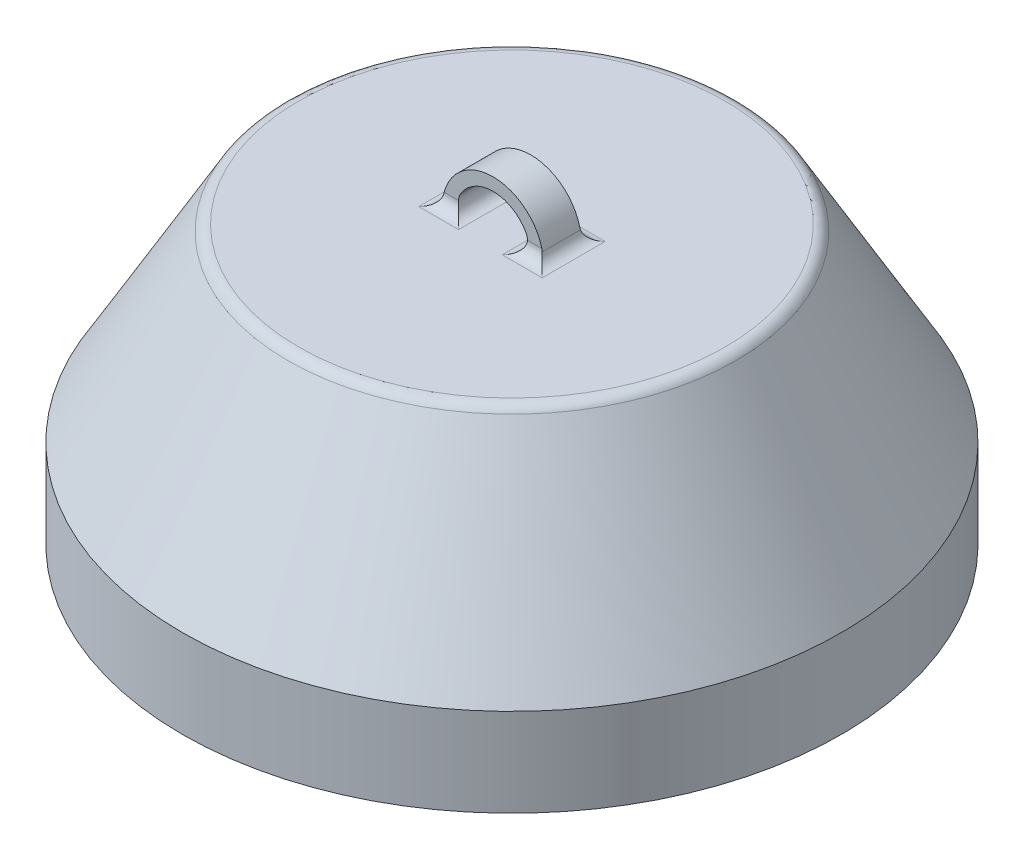
ISO-10303-21;
HEADER;
FILE_DESCRIPTION(('STEP AP214'),'2;1');
FILE_NAME('part.step','',(''),(''),'','','');
FILE_SCHEMA(('AUTOMOTIVE_DESIGN { 1 0 10303 214 1 1 1 1 }'));
ENDSEC;
DATA;
#1=APPLICATION_CONTEXT('core data for automotive mechanical design processes');
#2=APPLICATION_PROTOCOL_DEFINITION('international standard','automotive_design',2000,#1);
#3=PRODUCT_CONTEXT('',#1,'mechanical');
#4=PRODUCT('Part','Part','',(#3));
#5=PRODUCT_RELATED_PRODUCT_CATEGORY('part','',(#4));
#6=PRODUCT_DEFINITION_FORMATION('','',#4);
#7=PRODUCT_DEFINITION_CONTEXT('part definition',#1,'design');
#8=PRODUCT_DEFINITION('design','',#6,#7);
#9=PRODUCT_DEFINITION_SHAPE('','',#8);
#10=(LENGTH_UNIT() NAMED_UNIT(*) SI_UNIT(.MILLI.,.METRE.));
#11=(NAMED_UNIT(*) PLANE_ANGLE_UNIT() SI_UNIT($,.RADIAN.));
#12=(NAMED_UNIT(*) SI_UNIT($,.STERADIAN.) SOLID_ANGLE_UNIT());
#13=UNCERTAINTY_MEASURE_WITH_UNIT(LENGTH_MEASURE(1.E-05),#10,'distance_accuracy_value','');
#14=(GEOMETRIC_REPRESENTATION_CONTEXT(3) GLOBAL_UNCERTAINTY_ASSIGNED_CONTEXT((#13)) GLOBAL_UNIT_ASSIGNED_CONTEXT((#10,
#11,#12)) REPRESENTATION_CONTEXT('',''));
#15=CARTESIAN_POINT('',(0.,0.,0.));
#16=DIRECTION('',(0.,0.,1.));
#17=DIRECTION('',(1.,0.,0.));
#18=AXIS2_PLACEMENT_3D('',#15,#16,#17);
#19=CARTESIAN_POINT('',(0.,0.,0.));
#20=DIRECTION('',(0.,1.,0.));
#21=DIRECTION('',(0.,0.,1.));
#22=AXIS2_PLACEMENT_3D('',#19,#20,#21);
#23=PLANE('',#22);
#24=CARTESIAN_POINT('',(0.,0.,0.));
#25=DIRECTION('',(0.,1.,0.));
#26=DIRECTION('',(0.,0.,1.));
#27=AXIS2_PLACEMENT_3D('',#24,#25,#26);
#28=CIRCLE('',#27,26.15);
#29=CARTESIAN_POINT('',(0.,0.,26.15));
#30=VERTEX_POINT('',#29);
#31=EDGE_CURVE('E302',#30,#30,#28,.T.);
#32=ORIENTED_EDGE('',*,*,#31,.F.);
#33=EDGE_LOOP('',(#32));
#34=FACE_BOUND('',#33,.T.);
#35=CARTESIAN_POINT('',(0.,0.,0.));
#36=DIRECTION('',(0.,1.,0.));
#37=DIRECTION('',(0.,0.,1.));
#38=AXIS2_PLACEMENT_3D('',#35,#36,#37);
#39=CIRCLE('',#38,24.65);
#40=CARTESIAN_POINT('',(0.,0.,24.65));
#41=VERTEX_POINT('',#40);
#42=EDGE_CURVE('E305',#41,#41,#39,.T.);
#43=ORIENTED_EDGE('',*,*,#42,.T.);
#44=EDGE_LOOP('',(#43));
#45=FACE_BOUND('',#44,.T.);
#46=ADVANCED_FACE('F35',(#34,#45),#23,.F.);
#47=CARTESIAN_POINT('',(0.,7.,0.));
#48=DIRECTION('',(0.,-1.,0.));
#49=DIRECTION('',(0.,0.,-1.));
#50=AXIS2_PLACEMENT_3D('',#47,#48,#49);
#51=CYLINDRICAL_SURFACE('',#50,26.15);
#52=CARTESIAN_POINT('',(0.,7.,0.));
#53=DIRECTION('',(0.,1.,0.));
#54=DIRECTION('',(0.,0.,1.));
#55=AXIS2_PLACEMENT_3D('',#52,#53,#54);
#56=CIRCLE('',#55,26.15);
#57=CARTESIAN_POINT('',(0.,7.,26.15));
#58=VERTEX_POINT('',#57);
#59=EDGE_CURVE('E145',#58,#58,#56,.T.);
#60=ORIENTED_EDGE('',*,*,#59,.F.);
#61=EDGE_LOOP('',(#60));
#62=FACE_BOUND('',#61,.T.);
#63=ORIENTED_EDGE('',*,*,#31,.T.);
#64=EDGE_LOOP('',(#63));
#65=FACE_BOUND('',#64,.T.);
#66=ADVANCED_FACE('F243',(#62,#65),#51,.T.);
#67=CARTESIAN_POINT('',(0.,7.,0.));
#68=DIRECTION('',(0.,-1.,0.));
#69=DIRECTION('',(0.,0.,-1.));
#70=AXIS2_PLACEMENT_3D('',#67,#68,#69);
#71=CYLINDRICAL_SURFACE('',#70,24.65);
#72=CARTESIAN_POINT('',(0.,7.,0.));
#73=DIRECTION('',(0.,-1.,0.));
#74=DIRECTION('',(0.,0.,-1.));
#75=AXIS2_PLACEMENT_3D('',#72,#73,#74);
#76=CIRCLE('',#75,24.65);
#77=CARTESIAN_POINT('',(0.,7.,-24.65));
#78=VERTEX_POINT('',#77);
#79=EDGE_CURVE('E310',#78,#78,#76,.T.);
#80=ORIENTED_EDGE('',*,*,#79,.F.);
#81=EDGE_LOOP('',(#80));
#82=FACE_BOUND('',#81,.T.);
#83=ORIENTED_EDGE('',*,*,#42,.F.);
#84=EDGE_LOOP('',(#83));
#85=FACE_BOUND('',#84,.T.);
#86=ADVANCED_FACE('F249',(#82,#85),#71,.F.);
#87=CARTESIAN_POINT('',(0.,7.,0.));
#88=DIRECTION('',(0.,-1.,0.));
#89=DIRECTION('',(0.,0.,1.));
#90=AXIS2_PLACEMENT_3D('',#87,#88,#89);
#91=CONICAL_SURFACE('',#90,26.15,0.5235987755983);
#92=CARTESIAN_POINT('',(0.,21.5,0.));
#93=DIRECTION('',(0.,-1.,0.));
#94=DIRECTION('',(0.,0.,-1.));
#95=AXIS2_PLACEMENT_3D('',#92,#93,#94);
#96=CIRCLE('',#95,17.7784210967504);
#97=CARTESIAN_POINT('',(0.,21.5,-17.7784210967504));
#98=VERTEX_POINT('',#97);
#99=EDGE_CURVE('E166',#98,#98,#96,.T.);
#100=ORIENTED_EDGE('',*,*,#99,.T.);
#101=EDGE_LOOP('',(#100));
#102=FACE_BOUND('',#101,.T.);
#103=ORIENTED_EDGE('',*,*,#59,.T.);
#104=EDGE_LOOP('',(#103));
#105=FACE_BOUND('',#104,.T.);
#106=ADVANCED_FACE('F275',(#102,#105),#91,.T.);
#107=CARTESIAN_POINT('',(0.,22.,0.));
#108=DIRECTION('',(0.,1.,0.));
#109=DIRECTION('',(0.,0.,1.));
#110=AXIS2_PLACEMENT_3D('',#107,#108,#109);
#111=PLANE('',#110);
#112=CARTESIAN_POINT('',(0.,22.,0.));
#113=DIRECTION('',(0.,1.,0.));
#114=DIRECTION('',(0.,0.,1.));
#115=AXIS2_PLACEMENT_3D('',#112,#113,#114);
#116=CIRCLE('',#115,16.912395692966);
#117=CARTESIAN_POINT('',(0.,22.,16.912395692966));
#118=VERTEX_POINT('',#117);
#119=EDGE_CURVE('E163',#118,#118,#116,.T.);
#120=ORIENTED_EDGE('',*,*,#119,.T.);
#121=EDGE_LOOP('',(#120));
#122=FACE_BOUND('',#121,.T.);
#123=DIRECTION('',(1.,0.,0.));
#124=VECTOR('',#123,1.);
#125=CARTESIAN_POINT('',(0.,22.,-2.5));
#126=LINE('',#125,#124);
#127=CARTESIAN_POINT('',(1.73205080756888,22.,-2.5));
#128=VERTEX_POINT('',#127);
#129=CARTESIAN_POINT('',(4.89897948556636,22.,-2.5));
#130=VERTEX_POINT('',#129);
#131=EDGE_CURVE('E158',#128,#130,#126,.T.);
#132=ORIENTED_EDGE('',*,*,#131,.T.);
#133=DIRECTION('',(0.,0.,-1.));
#134=VECTOR('',#133,1.);
#135=CARTESIAN_POINT('',(4.89897948556636,22.,0.));
#136=LINE('',#135,#134);
#137=CARTESIAN_POINT('',(4.89897948556636,22.,2.5));
#138=VERTEX_POINT('',#137);
#139=EDGE_CURVE('E160',#130,#138,#136,.F.);
#140=ORIENTED_EDGE('',*,*,#139,.T.);
#141=DIRECTION('',(1.,0.,0.));
#142=VECTOR('',#141,1.);
#143=CARTESIAN_POINT('',(3.,22.,2.5));
#144=LINE('',#143,#142);
#145=CARTESIAN_POINT('',(1.73205080756888,22.,2.5));
#146=VERTEX_POINT('',#145);
#147=EDGE_CURVE('E150',#138,#146,#144,.F.);
#148=ORIENTED_EDGE('',*,*,#147,.T.);
#149=DIRECTION('',(0.,0.,-1.));
#150=VECTOR('',#149,1.);
#151=CARTESIAN_POINT('',(1.73205080756888,22.,0.));
#152=LINE('',#151,#150);
#153=EDGE_CURVE('E152',#146,#128,#152,.T.);
#154=ORIENTED_EDGE('',*,*,#153,.T.);
#155=EDGE_LOOP('',(#132,#140,#148,#154));
#156=FACE_BOUND('',#155,.T.);
#157=DIRECTION('',(1.,0.,0.));
#158=VECTOR('',#157,1.);
#159=CARTESIAN_POINT('',(0.,22.,-2.5));
#160=LINE('',#159,#158);
#161=CARTESIAN_POINT('',(-4.89897948556636,22.,-2.5));
#162=VERTEX_POINT('',#161);
#163=CARTESIAN_POINT('',(-1.73205080756888,22.,-2.5));
#164=VERTEX_POINT('',#163);
#165=EDGE_CURVE('E149',#162,#164,#160,.T.);
#166=ORIENTED_EDGE('',*,*,#165,.T.);
#167=DIRECTION('',(0.,0.,-1.));
#168=VECTOR('',#167,1.);
#169=CARTESIAN_POINT('',(-1.73205080756888,22.,0.));
#170=LINE('',#169,#168);
#171=CARTESIAN_POINT('',(-1.73205080756888,22.,2.5));
#172=VERTEX_POINT('',#171);
#173=EDGE_CURVE('E129',#164,#172,#170,.F.);
#174=ORIENTED_EDGE('',*,*,#173,.T.);
#175=DIRECTION('',(1.,0.,0.));
#176=VECTOR('',#175,1.);
#177=CARTESIAN_POINT('',(-4.,22.,2.5));
#178=LINE('',#177,#176);
#179=CARTESIAN_POINT('',(-4.89897948556636,22.,2.5));
#180=VERTEX_POINT('',#179);
#181=EDGE_CURVE('E139',#172,#180,#178,.F.);
#182=ORIENTED_EDGE('',*,*,#181,.T.);
#183=DIRECTION('',(0.,0.,-1.));
#184=VECTOR('',#183,1.);
#185=CARTESIAN_POINT('',(-4.89897948556636,22.,0.));
#186=LINE('',#185,#184);
#187=EDGE_CURVE('E144',#180,#162,#186,.T.);
#188=ORIENTED_EDGE('',*,*,#187,.T.);
#189=EDGE_LOOP('',(#166,#174,#182,#188));
#190=FACE_BOUND('',#189,.T.);
#191=ADVANCED_FACE('F147',(#122,#156,#190),#111,.T.);
#192=CARTESIAN_POINT('',(0.,7.,0.));
#193=DIRECTION('',(0.,-1.,0.));
#194=DIRECTION('',(0.,0.,-1.));
#195=AXIS2_PLACEMENT_3D('',#192,#193,#194);
#196=CONICAL_SURFACE('',#195,24.65,0.5235987755983);
#197=ORIENTED_EDGE('',*,*,#79,.T.);
#198=EDGE_LOOP('',(#197));
#199=FACE_BOUND('',#198,.T.);
#200=CARTESIAN_POINT('',(0.,20.5,0.));
#201=DIRECTION('',(0.,1.,0.));
#202=DIRECTION('',(0.,0.,1.));
#203=AXIS2_PLACEMENT_3D('',#200,#201,#202);
#204=CIRCLE('',#203,16.85577136594);
#205=CARTESIAN_POINT('',(0.,20.5,16.85577136594));
#206=VERTEX_POINT('',#205);
#207=EDGE_CURVE('E311',#206,#206,#204,.F.);
#208=ORIENTED_EDGE('',*,*,#207,.F.);
#209=EDGE_LOOP('',(#208));
#210=FACE_BOUND('',#209,.T.);
#211=ADVANCED_FACE('F274',(#199,#210),#196,.F.);
#212=CARTESIAN_POINT('',(0.,20.5,0.));
#213=DIRECTION('',(0.,1.,0.));
#214=DIRECTION('',(0.,0.,1.));
#215=AXIS2_PLACEMENT_3D('',#212,#213,#214);
#216=PLANE('',#215);
#217=ORIENTED_EDGE('',*,*,#207,.T.);
#218=EDGE_LOOP('',(#217));
#219=FACE_BOUND('',#218,.T.);
#220=ADVANCED_FACE('F332',(#219),#216,.F.);
#221=CARTESIAN_POINT('',(0.,22.,1.5));
#222=DIRECTION('',(0.,0.,-1.));
#223=DIRECTION('',(-1.,0.,0.));
#224=AXIS2_PLACEMENT_3D('',#221,#222,#223);
#225=CYLINDRICAL_SURFACE('',#224,4.);
#226=CARTESIAN_POINT('',(0.,22.,1.5));
#227=DIRECTION('',(0.,0.,1.));
#228=DIRECTION('',(1.,0.,0.));
#229=AXIS2_PLACEMENT_3D('',#226,#227,#228);
#230=CIRCLE('',#229,4.);
#231=CARTESIAN_POINT('',(3.87298334620742,23.,1.5));
#232=VERTEX_POINT('',#231);
#233=CARTESIAN_POINT('',(-3.87298334620742,23.,1.5));
#234=VERTEX_POINT('',#233);
#235=EDGE_CURVE('E320',#232,#234,#230,.T.);
#236=ORIENTED_EDGE('',*,*,#235,.F.);
#237=CARTESIAN_POINT('',(3.87298334620742,23.,1.5));
#238=CARTESIAN_POINT('',(3.88161367079,22.9665400879856,1.49998709194956));
#239=CARTESIAN_POINT('',(3.88977885326883,22.9331434653097,1.5016643131653));
#240=CARTESIAN_POINT('',(3.90517893401717,22.8664767986431,1.50839901412834));
#241=CARTESIAN_POINT('',(3.91241383228689,22.8332067546523,1.51345649387485));
#242=CARTESIAN_POINT('',(3.91918358845308,22.8,1.52020410288673));
#243=B_SPLINE_CURVE_WITH_KNOTS('',3,(#237,#238,#239,#240,#241,#242),.UNSPECIFIED.,.F.,.F.,(4,2,
4),(0.,0.103263542156258,0.206527084287963),.UNSPECIFIED.);
#244=CARTESIAN_POINT('',(3.91918358845308,22.8,1.52020410288673));
#245=VERTEX_POINT('',#244);
#246=EDGE_CURVE('E214',#232,#245,#243,.T.);
#247=ORIENTED_EDGE('',*,*,#246,.T.);
#248=DIRECTION('',(0.,0.,-1.));
#249=VECTOR('',#248,1.);
#250=CARTESIAN_POINT('',(3.91918358845309,22.8,1.5));
#251=LINE('',#250,#249);
#252=CARTESIAN_POINT('',(3.91918358845308,22.8,-1.52020410288673));
#253=VERTEX_POINT('',#252);
#254=EDGE_CURVE('E170',#245,#253,#251,.T.);
#255=ORIENTED_EDGE('',*,*,#254,.T.);
#256=CARTESIAN_POINT('',(3.91918358845308,22.8,-1.52020410288673));
#257=CARTESIAN_POINT('',(3.91241383228687,22.8332067546522,-1.51345649387486));
#258=CARTESIAN_POINT('',(3.90517893401715,22.8664767986431,-1.50839901412835));
#259=CARTESIAN_POINT('',(3.88977885326885,22.9331434653097,-1.50166431316529));
#260=CARTESIAN_POINT('',(3.88161367079005,22.9665400879856,-1.49998709194953));
#261=CARTESIAN_POINT('',(3.87298334620752,23.,-1.49999999999995));
#262=B_SPLINE_CURVE_WITH_KNOTS('',3,(#256,#257,#258,#259,#260,#261),.UNSPECIFIED.,.F.,.F.,(4,2,
4),(0.,0.103263542131702,0.206527084287951),.UNSPECIFIED.);
#263=CARTESIAN_POINT('',(3.87298334620742,23.,-1.5));
#264=VERTEX_POINT('',#263);
#265=EDGE_CURVE('E185',#253,#264,#262,.T.);
#266=ORIENTED_EDGE('',*,*,#265,.T.);
#267=CARTESIAN_POINT('',(0.,22.,-1.5));
#268=DIRECTION('',(0.,0.,1.));
#269=DIRECTION('',(1.,0.,0.));
#270=AXIS2_PLACEMENT_3D('',#267,#268,#269);
#271=CIRCLE('',#270,4.);
#272=CARTESIAN_POINT('',(-3.87298334620742,23.,-1.5));
#273=VERTEX_POINT('',#272);
#274=EDGE_CURVE('E298',#264,#273,#271,.T.);
#275=ORIENTED_EDGE('',*,*,#274,.T.);
#276=CARTESIAN_POINT('',(-3.87298334620742,23.,-1.5));
#277=CARTESIAN_POINT('',(-3.88161367079,22.9665400879856,-1.49998709194956));
#278=CARTESIAN_POINT('',(-3.88977885326883,22.9331434653097,-1.5016643131653));
#279=CARTESIAN_POINT('',(-3.90517893401717,22.8664767986431,-1.50839901412834));
#280=CARTESIAN_POINT('',(-3.91241383228689,22.8332067546523,-1.51345649387485));
#281=CARTESIAN_POINT('',(-3.91918358845308,22.8,-1.52020410288673));
#282=B_SPLINE_CURVE_WITH_KNOTS('',3,(#276,#277,#278,#279,#280,#281),.UNSPECIFIED.,.F.,.F.,(4,2,
4),(0.,0.103263542156258,0.206527084287963),.UNSPECIFIED.);
#283=CARTESIAN_POINT('',(-3.91918358845308,22.8,-1.52020410288673));
#284=VERTEX_POINT('',#283);
#285=EDGE_CURVE('E44',#273,#284,#282,.T.);
#286=ORIENTED_EDGE('',*,*,#285,.T.);
#287=DIRECTION('',(0.,0.,-1.));
#288=VECTOR('',#287,1.);
#289=CARTESIAN_POINT('',(-3.91918358845309,22.8,1.5));
#290=LINE('',#289,#288);
#291=CARTESIAN_POINT('',(-3.91918358845308,22.8,1.52020410288673));
#292=VERTEX_POINT('',#291);
#293=EDGE_CURVE('E51',#284,#292,#290,.F.);
#294=ORIENTED_EDGE('',*,*,#293,.T.);
#295=CARTESIAN_POINT('',(-3.91918358845308,22.8,1.52020410288673));
#296=CARTESIAN_POINT('',(-3.91241383228687,22.8332067546522,1.51345649387486));
#297=CARTESIAN_POINT('',(-3.90517893401715,22.8664767986431,1.50839901412835));
#298=CARTESIAN_POINT('',(-3.88977885326885,22.9331434653097,1.50166431316529));
#299=CARTESIAN_POINT('',(-3.88161367079005,22.9665400879856,1.49998709194953));
#300=CARTESIAN_POINT('',(-3.87298334620752,23.,1.49999999999995));
#301=B_SPLINE_CURVE_WITH_KNOTS('',3,(#295,#296,#297,#298,#299,#300),.UNSPECIFIED.,.F.,.F.,(4,2,
4),(0.,0.103263542131702,0.206527084287951),.UNSPECIFIED.);
#302=EDGE_CURVE('E12',#292,#234,#301,.T.);
#303=ORIENTED_EDGE('',*,*,#302,.T.);
#304=EDGE_LOOP('',(#236,#247,#255,#266,#275,#286,#294,#303));
#305=FACE_BOUND('',#304,.T.);
#306=ADVANCED_FACE('F194',(#305),#225,.T.);
#307=CARTESIAN_POINT('',(0.,22.,1.5));
#308=DIRECTION('',(0.,0.,-1.));
#309=DIRECTION('',(-1.,0.,0.));
#310=AXIS2_PLACEMENT_3D('',#307,#308,#309);
#311=CYLINDRICAL_SURFACE('',#310,3.);
#312=CARTESIAN_POINT('',(0.,22.,-1.5));
#313=DIRECTION('',(0.,0.,-1.));
#314=DIRECTION('',(1.,0.,0.));
#315=AXIS2_PLACEMENT_3D('',#312,#313,#314);
#316=CIRCLE('',#315,3.);
#317=CARTESIAN_POINT('',(-2.59807621135332,23.5,-1.5));
#318=VERTEX_POINT('',#317);
#319=CARTESIAN_POINT('',(2.59807621135332,23.5,-1.5));
#320=VERTEX_POINT('',#319);
#321=EDGE_CURVE('E317',#318,#320,#316,.T.);
#322=ORIENTED_EDGE('',*,*,#321,.T.);
#323=DIRECTION('',(0.,0.,-1.));
#324=VECTOR('',#323,1.);
#325=CARTESIAN_POINT('',(2.59807621135332,23.5,1.5));
#326=LINE('',#325,#324);
#327=CARTESIAN_POINT('',(2.59807621135332,23.5,1.5));
#328=VERTEX_POINT('',#327);
#329=EDGE_CURVE('E179',#320,#328,#326,.F.);
#330=ORIENTED_EDGE('',*,*,#329,.T.);
#331=CARTESIAN_POINT('',(0.,22.,1.5));
#332=DIRECTION('',(0.,0.,-1.));
#333=DIRECTION('',(1.,0.,0.));
#334=AXIS2_PLACEMENT_3D('',#331,#332,#333);
#335=CIRCLE('',#334,3.);
#336=CARTESIAN_POINT('',(-2.59807621135332,23.5,1.5));
#337=VERTEX_POINT('',#336);
#338=EDGE_CURVE('E314',#337,#328,#335,.T.);
#339=ORIENTED_EDGE('',*,*,#338,.F.);
#340=DIRECTION('',(0.,0.,-1.));
#341=VECTOR('',#340,1.);
#342=CARTESIAN_POINT('',(-2.59807621135332,23.5,1.5));
#343=LINE('',#342,#341);
#344=EDGE_CURVE('E176',#337,#318,#343,.T.);
#345=ORIENTED_EDGE('',*,*,#344,.T.);
#346=EDGE_LOOP('',(#322,#330,#339,#345));
#347=FACE_BOUND('',#346,.T.);
#348=ADVANCED_FACE('F331',(#347),#311,.F.);
#349=CARTESIAN_POINT('',(0.,22.,1.5));
#350=DIRECTION('',(0.,0.,1.));
#351=DIRECTION('',(1.,0.,0.));
#352=AXIS2_PLACEMENT_3D('',#349,#350,#351);
#353=PLANE('',#352);
#354=CARTESIAN_POINT('',(1.73205080756888,23.,1.5));
#355=DIRECTION('',(0.,0.,1.));
#356=DIRECTION('',(1.,0.,0.));
#357=AXIS2_PLACEMENT_3D('',#354,#355,#356);
#358=CIRCLE('',#357,1.);
#359=CARTESIAN_POINT('',(2.73205080756888,23.,1.5));
#360=VERTEX_POINT('',#359);
#361=EDGE_CURVE('E221',#328,#360,#358,.F.);
#362=ORIENTED_EDGE('',*,*,#361,.T.);
#363=DIRECTION('',(1.,0.,0.));
#364=VECTOR('',#363,1.);
#365=CARTESIAN_POINT('',(4.,23.,1.5));
#366=LINE('',#365,#364);
#367=EDGE_CURVE('E183',#360,#232,#366,.T.);
#368=ORIENTED_EDGE('',*,*,#367,.T.);
#369=ORIENTED_EDGE('',*,*,#235,.T.);
#370=DIRECTION('',(1.,0.,0.));
#371=VECTOR('',#370,1.);
#372=CARTESIAN_POINT('',(-3.,23.,1.5));
#373=LINE('',#372,#371);
#374=CARTESIAN_POINT('',(-2.73205080756888,23.,1.5));
#375=VERTEX_POINT('',#374);
#376=EDGE_CURVE('E181',#234,#375,#373,.T.);
#377=ORIENTED_EDGE('',*,*,#376,.T.);
#378=CARTESIAN_POINT('',(-1.73205080756888,23.,1.5));
#379=DIRECTION('',(0.,0.,1.));
#380=DIRECTION('',(1.,0.,0.));
#381=AXIS2_PLACEMENT_3D('',#378,#379,#380);
#382=CIRCLE('',#381,1.);
#383=EDGE_CURVE('E132',#375,#337,#382,.F.);
#384=ORIENTED_EDGE('',*,*,#383,.T.);
#385=ORIENTED_EDGE('',*,*,#338,.T.);
#386=EDGE_LOOP('',(#362,#368,#369,#377,#384,#385));
#387=FACE_BOUND('',#386,.T.);
#388=ADVANCED_FACE('F265',(#387),#353,.T.);
#389=CARTESIAN_POINT('',(0.,22.,-1.5));
#390=DIRECTION('',(0.,0.,1.));
#391=DIRECTION('',(1.,0.,0.));
#392=AXIS2_PLACEMENT_3D('',#389,#390,#391);
#393=PLANE('',#392);
#394=ORIENTED_EDGE('',*,*,#274,.F.);
#395=DIRECTION('',(1.,0.,0.));
#396=VECTOR('',#395,1.);
#397=CARTESIAN_POINT('',(0.,23.,-1.5));
#398=LINE('',#397,#396);
#399=CARTESIAN_POINT('',(2.73205080756888,23.,-1.5));
#400=VERTEX_POINT('',#399);
#401=EDGE_CURVE('E174',#264,#400,#398,.F.);
#402=ORIENTED_EDGE('',*,*,#401,.T.);
#403=CARTESIAN_POINT('',(1.73205080756888,23.,-1.5));
#404=DIRECTION('',(0.,0.,1.));
#405=DIRECTION('',(1.,0.,0.));
#406=AXIS2_PLACEMENT_3D('',#403,#404,#405);
#407=CIRCLE('',#406,1.);
#408=EDGE_CURVE('E192',#400,#320,#407,.T.);
#409=ORIENTED_EDGE('',*,*,#408,.T.);
#410=ORIENTED_EDGE('',*,*,#321,.F.);
#411=CARTESIAN_POINT('',(-1.73205080756888,23.,-1.5));
#412=DIRECTION('',(0.,0.,1.));
#413=DIRECTION('',(1.,0.,0.));
#414=AXIS2_PLACEMENT_3D('',#411,#412,#413);
#415=CIRCLE('',#414,1.);
#416=CARTESIAN_POINT('',(-2.73205080756888,23.,-1.5));
#417=VERTEX_POINT('',#416);
#418=EDGE_CURVE('E220',#318,#417,#415,.T.);
#419=ORIENTED_EDGE('',*,*,#418,.T.);
#420=DIRECTION('',(1.,0.,0.));
#421=VECTOR('',#420,1.);
#422=CARTESIAN_POINT('',(0.,23.,-1.5));
#423=LINE('',#422,#421);
#424=EDGE_CURVE('E172',#417,#273,#423,.F.);
#425=ORIENTED_EDGE('',*,*,#424,.T.);
#426=EDGE_LOOP('',(#394,#402,#409,#410,#419,#425));
#427=FACE_BOUND('',#426,.T.);
#428=ADVANCED_FACE('F258',(#427),#393,.F.);
#429=CARTESIAN_POINT('',(0.,21.,0.));
#430=DIRECTION('',(0.,1.,0.));
#431=DIRECTION('',(0.,0.,1.));
#432=AXIS2_PLACEMENT_3D('',#429,#430,#431);
#433=TOROIDAL_SURFACE('',#432,16.912395692966,1.);
#434=ORIENTED_EDGE('',*,*,#99,.F.);
#435=EDGE_LOOP('',(#434));
#436=FACE_BOUND('',#435,.T.);
#437=ORIENTED_EDGE('',*,*,#119,.F.);
#438=EDGE_LOOP('',(#437));
#439=FACE_BOUND('',#438,.T.);
#440=ADVANCED_FACE('F256',(#436,#439),#433,.T.);
#441=CARTESIAN_POINT('',(1.73205080756888,23.,1.5));
#442=DIRECTION('',(0.,0.,-1.));
#443=DIRECTION('',(-1.,0.,0.));
#444=AXIS2_PLACEMENT_3D('',#441,#442,#443);
#445=CYLINDRICAL_SURFACE('',#444,1.);
#446=CARTESIAN_POINT('',(1.73205080756888,23.,-2.5));
#447=DIRECTION('',(0.707106781186547,0.,-0.707106781186547));
#448=DIRECTION('',(-0.707106781186547,0.,-0.707106781186547));
#449=AXIS2_PLACEMENT_3D('',#446,#447,#448);
#450=ELLIPSE('',#449,1.41421356237309,1.);
#451=EDGE_CURVE('E291',#128,#400,#450,.F.);
#452=ORIENTED_EDGE('',*,*,#451,.F.);
#453=ORIENTED_EDGE('',*,*,#153,.F.);
#454=CARTESIAN_POINT('',(1.73205080756888,23.,2.5));
#455=DIRECTION('',(-0.707106781186547,0.,-0.707106781186547));
#456=DIRECTION('',(-0.707106781186547,0.,0.707106781186547));
#457=AXIS2_PLACEMENT_3D('',#454,#455,#456);
#458=ELLIPSE('',#457,1.41421356237309,1.);
#459=EDGE_CURVE('E295',#360,#146,#458,.T.);
#460=ORIENTED_EDGE('',*,*,#459,.F.);
#461=ORIENTED_EDGE('',*,*,#361,.F.);
#462=ORIENTED_EDGE('',*,*,#329,.F.);
#463=ORIENTED_EDGE('',*,*,#408,.F.);
#464=EDGE_LOOP('',(#452,#453,#460,#461,#462,#463));
#465=FACE_BOUND('',#464,.T.);
#466=ADVANCED_FACE('F210',(#465),#445,.F.);
#467=CARTESIAN_POINT('',(0.,23.,2.5));
#468=DIRECTION('',(-1.,0.,0.));
#469=DIRECTION('',(0.,0.,1.));
#470=AXIS2_PLACEMENT_3D('',#467,#468,#469);
#471=CYLINDRICAL_SURFACE('',#470,1.);
#472=ORIENTED_EDGE('',*,*,#459,.T.);
#473=ORIENTED_EDGE('',*,*,#147,.F.);
#474=CARTESIAN_POINT('',(4.89897948556636,23.,2.5));
#475=DIRECTION('',(-0.707106781186547,0.,0.707106781186547));
#476=DIRECTION('',(-0.707106781186547,0.,-0.707106781186547));
#477=AXIS2_PLACEMENT_3D('',#474,#475,#476);
#478=ELLIPSE('',#477,1.41421356237309,1.);
#479=EDGE_CURVE('E287',#245,#138,#478,.T.);
#480=ORIENTED_EDGE('',*,*,#479,.F.);
#481=ORIENTED_EDGE('',*,*,#246,.F.);
#482=ORIENTED_EDGE('',*,*,#367,.F.);
#483=EDGE_LOOP('',(#472,#473,#480,#481,#482));
#484=FACE_BOUND('',#483,.T.);
#485=ADVANCED_FACE('F204',(#484),#471,.F.);
#486=CARTESIAN_POINT('',(0.,23.,-2.5));
#487=DIRECTION('',(1.,0.,0.));
#488=DIRECTION('',(0.,0.,-1.));
#489=AXIS2_PLACEMENT_3D('',#486,#487,#488);
#490=CYLINDRICAL_SURFACE('',#489,1.);
#491=ORIENTED_EDGE('',*,*,#401,.F.);
#492=ORIENTED_EDGE('',*,*,#265,.F.);
#493=CARTESIAN_POINT('',(4.89897948556636,23.,-2.5));
#494=DIRECTION('',(0.707106781186547,0.,0.707106781186547));
#495=DIRECTION('',(0.707106781186547,0.,-0.707106781186547));
#496=AXIS2_PLACEMENT_3D('',#493,#494,#495);
#497=ELLIPSE('',#496,1.41421356237309,1.);
#498=EDGE_CURVE('E285',#130,#253,#497,.F.);
#499=ORIENTED_EDGE('',*,*,#498,.F.);
#500=ORIENTED_EDGE('',*,*,#131,.F.);
#501=ORIENTED_EDGE('',*,*,#451,.T.);
#502=EDGE_LOOP('',(#491,#492,#499,#500,#501));
#503=FACE_BOUND('',#502,.T.);
#504=ADVANCED_FACE('F198',(#503),#490,.F.);
#505=CARTESIAN_POINT('',(4.89897948556636,23.,1.5));
#506=DIRECTION('',(0.,0.,-1.));
#507=DIRECTION('',(-1.,0.,0.));
#508=AXIS2_PLACEMENT_3D('',#505,#506,#507);
#509=CYLINDRICAL_SURFACE('',#508,1.);
#510=ORIENTED_EDGE('',*,*,#479,.T.);
#511=ORIENTED_EDGE('',*,*,#139,.F.);
#512=ORIENTED_EDGE('',*,*,#498,.T.);
#513=ORIENTED_EDGE('',*,*,#254,.F.);
#514=EDGE_LOOP('',(#510,#511,#512,#513));
#515=FACE_BOUND('',#514,.T.);
#516=ADVANCED_FACE('F203',(#515),#509,.F.);
#517=CARTESIAN_POINT('',(-4.89897948556636,23.,1.5));
#518=DIRECTION('',(0.,0.,-1.));
#519=DIRECTION('',(-1.,0.,0.));
#520=AXIS2_PLACEMENT_3D('',#517,#518,#519);
#521=CYLINDRICAL_SURFACE('',#520,1.);
#522=CARTESIAN_POINT('',(-4.89897948556636,23.,-2.5));
#523=DIRECTION('',(0.707106781186547,0.,-0.707106781186547));
#524=DIRECTION('',(-0.707106781186547,0.,-0.707106781186547));
#525=AXIS2_PLACEMENT_3D('',#522,#523,#524);
#526=ELLIPSE('',#525,1.41421356237309,1.);
#527=EDGE_CURVE('E135',#162,#284,#526,.F.);
#528=ORIENTED_EDGE('',*,*,#527,.F.);
#529=ORIENTED_EDGE('',*,*,#187,.F.);
#530=CARTESIAN_POINT('',(-4.89897948556636,23.,2.5));
#531=DIRECTION('',(-0.707106781186547,0.,-0.707106781186547));
#532=DIRECTION('',(-0.707106781186547,0.,0.707106781186547));
#533=AXIS2_PLACEMENT_3D('',#530,#531,#532);
#534=ELLIPSE('',#533,1.41421356237309,1.);
#535=EDGE_CURVE('E39',#292,#180,#534,.T.);
#536=ORIENTED_EDGE('',*,*,#535,.F.);
#537=ORIENTED_EDGE('',*,*,#293,.F.);
#538=EDGE_LOOP('',(#528,#529,#536,#537));
#539=FACE_BOUND('',#538,.T.);
#540=ADVANCED_FACE('F37',(#539),#521,.F.);
#541=CARTESIAN_POINT('',(0.,23.,2.5));
#542=DIRECTION('',(-1.,0.,0.));
#543=DIRECTION('',(0.,0.,1.));
#544=AXIS2_PLACEMENT_3D('',#541,#542,#543);
#545=CYLINDRICAL_SURFACE('',#544,1.);
#546=ORIENTED_EDGE('',*,*,#535,.T.);
#547=ORIENTED_EDGE('',*,*,#181,.F.);
#548=CARTESIAN_POINT('',(-1.73205080756888,23.,2.5));
#549=DIRECTION('',(-0.707106781186547,0.,0.707106781186547));
#550=DIRECTION('',(-0.707106781186547,0.,-0.707106781186547));
#551=AXIS2_PLACEMENT_3D('',#548,#549,#550);
#552=ELLIPSE('',#551,1.41421356237309,1.);
#553=EDGE_CURVE('E124',#375,#172,#552,.T.);
#554=ORIENTED_EDGE('',*,*,#553,.F.);
#555=ORIENTED_EDGE('',*,*,#376,.F.);
#556=ORIENTED_EDGE('',*,*,#302,.F.);
#557=EDGE_LOOP('',(#546,#547,#554,#555,#556));
#558=FACE_BOUND('',#557,.T.);
#559=ADVANCED_FACE('F140',(#558),#545,.F.);
#560=CARTESIAN_POINT('',(0.,23.,-2.5));
#561=DIRECTION('',(1.,0.,0.));
#562=DIRECTION('',(0.,0.,-1.));
#563=AXIS2_PLACEMENT_3D('',#560,#561,#562);
#564=CYLINDRICAL_SURFACE('',#563,1.);
#565=ORIENTED_EDGE('',*,*,#424,.F.);
#566=CARTESIAN_POINT('',(-1.73205080756888,23.,-2.5));
#567=DIRECTION('',(0.707106781186547,0.,0.707106781186547));
#568=DIRECTION('',(0.707106781186547,0.,-0.707106781186547));
#569=AXIS2_PLACEMENT_3D('',#566,#567,#568);
#570=ELLIPSE('',#569,1.41421356237309,1.);
#571=EDGE_CURVE('E136',#164,#417,#570,.F.);
#572=ORIENTED_EDGE('',*,*,#571,.F.);
#573=ORIENTED_EDGE('',*,*,#165,.F.);
#574=ORIENTED_EDGE('',*,*,#527,.T.);
#575=ORIENTED_EDGE('',*,*,#285,.F.);
#576=EDGE_LOOP('',(#565,#572,#573,#574,#575));
#577=FACE_BOUND('',#576,.T.);
#578=ADVANCED_FACE('F233',(#577),#564,.F.);
#579=CARTESIAN_POINT('',(-1.73205080756888,23.,1.5));
#580=DIRECTION('',(0.,0.,-1.));
#581=DIRECTION('',(-1.,0.,0.));
#582=AXIS2_PLACEMENT_3D('',#579,#580,#581);
#583=CYLINDRICAL_SURFACE('',#582,1.);
#584=ORIENTED_EDGE('',*,*,#553,.T.);
#585=ORIENTED_EDGE('',*,*,#173,.F.);
#586=ORIENTED_EDGE('',*,*,#571,.T.);
#587=ORIENTED_EDGE('',*,*,#418,.F.);
#588=ORIENTED_EDGE('',*,*,#344,.F.);
#589=ORIENTED_EDGE('',*,*,#383,.F.);
#590=EDGE_LOOP('',(#584,#585,#586,#587,#588,#589));
#591=FACE_BOUND('',#590,.T.);
#592=ADVANCED_FACE('F126',(#591),#583,.F.);
#593=CLOSED_SHELL('',(#46,#66,#86,#106,#191,#211,#220,#306,#348,#388,#428,#440,#466,#485,#504,
#516,#540,#559,#578,#592));
#594=MANIFOLD_SOLID_BREP('B2',#593);
#595=ADVANCED_BREP_SHAPE_REPRESENTATION('',(#18,#594),#14);
#596=SHAPE_DEFINITION_REPRESENTATION(#9,#595);
ENDSEC;
END-ISO-10303-21;
